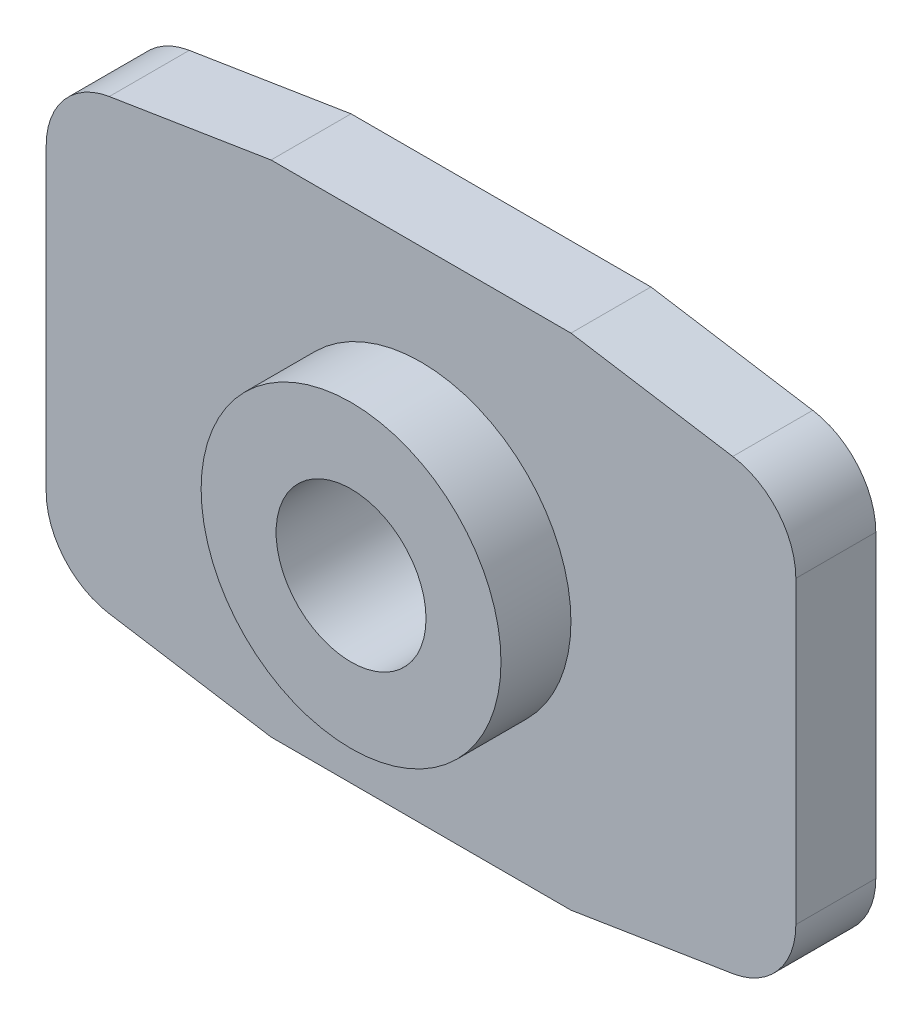
ISO-10303-21;
HEADER;
FILE_DESCRIPTION(('STEP AP214'),'2;1');
FILE_NAME('part.step','',(''),(''),'','','');
FILE_SCHEMA(('AUTOMOTIVE_DESIGN { 1 0 10303 214 1 1 1 1 }'));
ENDSEC;
DATA;
#1=APPLICATION_CONTEXT('core data for automotive mechanical design processes');
#2=APPLICATION_PROTOCOL_DEFINITION('international standard','automotive_design',2000,#1);
#3=PRODUCT_CONTEXT('',#1,'mechanical');
#4=PRODUCT('Part','Part','',(#3));
#5=PRODUCT_RELATED_PRODUCT_CATEGORY('part','',(#4));
#6=PRODUCT_DEFINITION_FORMATION('','',#4);
#7=PRODUCT_DEFINITION_CONTEXT('part definition',#1,'design');
#8=PRODUCT_DEFINITION('design','',#6,#7);
#9=PRODUCT_DEFINITION_SHAPE('','',#8);
#10=(LENGTH_UNIT() NAMED_UNIT(*) SI_UNIT(.MILLI.,.METRE.));
#11=(NAMED_UNIT(*) PLANE_ANGLE_UNIT() SI_UNIT($,.RADIAN.));
#12=(NAMED_UNIT(*) SI_UNIT($,.STERADIAN.) SOLID_ANGLE_UNIT());
#13=UNCERTAINTY_MEASURE_WITH_UNIT(LENGTH_MEASURE(1.E-05),#10,'distance_accuracy_value','');
#14=(GEOMETRIC_REPRESENTATION_CONTEXT(3) GLOBAL_UNCERTAINTY_ASSIGNED_CONTEXT((#13)) GLOBAL_UNIT_ASSIGNED_CONTEXT((#10,
#11,#12)) REPRESENTATION_CONTEXT('',''));
#15=CARTESIAN_POINT('',(0.,0.,0.));
#16=DIRECTION('',(0.,0.,1.));
#17=DIRECTION('',(1.,0.,0.));
#18=AXIS2_PLACEMENT_3D('',#15,#16,#17);
#19=CARTESIAN_POINT('',(6.,3.,1.6));
#20=DIRECTION('',(0.,0.,1.));
#21=DIRECTION('',(1.,0.,0.));
#22=AXIS2_PLACEMENT_3D('',#19,#20,#21);
#23=PLANE('',#22);
#24=CARTESIAN_POINT('',(6.,3.,1.6));
#25=DIRECTION('',(0.,0.,1.));
#26=DIRECTION('',(1.,0.,0.));
#27=AXIS2_PLACEMENT_3D('',#24,#25,#26);
#28=CIRCLE('',#27,1.5);
#29=CARTESIAN_POINT('',(7.5,3.,1.6));
#30=VERTEX_POINT('',#29);
#31=CARTESIAN_POINT('',(6.23739675280407,4.48109512920611,1.6));
#32=VERTEX_POINT('',#31);
#33=EDGE_CURVE('E185',#30,#32,#28,.T.);
#34=ORIENTED_EDGE('',*,*,#33,.T.);
#35=DIRECTION('',(-0.987396752804077,0.158264501869385,0.));
#36=VECTOR('',#35,1.);
#37=CARTESIAN_POINT('',(6.23739675280407,4.48109512920611,1.6));
#38=LINE('',#37,#36);
#39=CARTESIAN_POINT('',(3.,5.,1.6));
#40=VERTEX_POINT('',#39);
#41=EDGE_CURVE('E113',#32,#40,#38,.T.);
#42=ORIENTED_EDGE('',*,*,#41,.T.);
#43=DIRECTION('',(-1.,0.,0.));
#44=VECTOR('',#43,1.);
#45=CARTESIAN_POINT('',(-3.,5.,1.6));
#46=LINE('',#45,#44);
#47=CARTESIAN_POINT('',(-3.,5.,1.6));
#48=VERTEX_POINT('',#47);
#49=EDGE_CURVE('E212',#40,#48,#46,.T.);
#50=ORIENTED_EDGE('',*,*,#49,.T.);
#51=DIRECTION('',(-0.987396752804077,-0.158264501869386,0.));
#52=VECTOR('',#51,1.);
#53=CARTESIAN_POINT('',(-6.23739675280407,4.48109512920611,1.6));
#54=LINE('',#53,#52);
#55=CARTESIAN_POINT('',(-6.23739675280407,4.48109512920611,1.6));
#56=VERTEX_POINT('',#55);
#57=EDGE_CURVE('E230',#48,#56,#54,.T.);
#58=ORIENTED_EDGE('',*,*,#57,.T.);
#59=CARTESIAN_POINT('',(-6.,3.,1.6));
#60=DIRECTION('',(0.,0.,1.));
#61=DIRECTION('',(-1.,0.,0.));
#62=AXIS2_PLACEMENT_3D('',#59,#60,#61);
#63=CIRCLE('',#62,1.5);
#64=CARTESIAN_POINT('',(-7.5,3.,1.6));
#65=VERTEX_POINT('',#64);
#66=EDGE_CURVE('E227',#56,#65,#63,.T.);
#67=ORIENTED_EDGE('',*,*,#66,.T.);
#68=DIRECTION('',(0.,-1.,0.));
#69=VECTOR('',#68,1.);
#70=CARTESIAN_POINT('',(-7.5,-3.,1.6));
#71=LINE('',#70,#69);
#72=CARTESIAN_POINT('',(-7.5,-3.,1.6));
#73=VERTEX_POINT('',#72);
#74=EDGE_CURVE('E229',#65,#73,#71,.T.);
#75=ORIENTED_EDGE('',*,*,#74,.T.);
#76=CARTESIAN_POINT('',(-6.,-3.,1.6));
#77=DIRECTION('',(0.,0.,1.));
#78=DIRECTION('',(1.,0.,0.));
#79=AXIS2_PLACEMENT_3D('',#76,#77,#78);
#80=CIRCLE('',#79,1.5);
#81=CARTESIAN_POINT('',(-6.23739675280407,-4.48109512920612,1.6));
#82=VERTEX_POINT('',#81);
#83=EDGE_CURVE('E232',#73,#82,#80,.T.);
#84=ORIENTED_EDGE('',*,*,#83,.T.);
#85=DIRECTION('',(0.987396752804077,-0.158264501869385,0.));
#86=VECTOR('',#85,1.);
#87=CARTESIAN_POINT('',(-6.23739675280407,-4.48109512920612,1.6));
#88=LINE('',#87,#86);
#89=CARTESIAN_POINT('',(-3.,-5.,1.6));
#90=VERTEX_POINT('',#89);
#91=EDGE_CURVE('E238',#82,#90,#88,.T.);
#92=ORIENTED_EDGE('',*,*,#91,.T.);
#93=DIRECTION('',(1.,0.,0.));
#94=VECTOR('',#93,1.);
#95=CARTESIAN_POINT('',(-3.,-5.,1.6));
#96=LINE('',#95,#94);
#97=CARTESIAN_POINT('',(3.,-5.,1.6));
#98=VERTEX_POINT('',#97);
#99=EDGE_CURVE('E144',#90,#98,#96,.T.);
#100=ORIENTED_EDGE('',*,*,#99,.T.);
#101=DIRECTION('',(0.987396752804077,0.158264501869385,0.));
#102=VECTOR('',#101,1.);
#103=CARTESIAN_POINT('',(6.23739675280407,-4.48109512920611,1.6));
#104=LINE('',#103,#102);
#105=CARTESIAN_POINT('',(6.23739675280407,-4.48109512920612,1.6));
#106=VERTEX_POINT('',#105);
#107=EDGE_CURVE('E138',#98,#106,#104,.T.);
#108=ORIENTED_EDGE('',*,*,#107,.T.);
#109=CARTESIAN_POINT('',(6.,-3.,1.6));
#110=DIRECTION('',(0.,0.,1.));
#111=DIRECTION('',(-1.,0.,0.));
#112=AXIS2_PLACEMENT_3D('',#109,#110,#111);
#113=CIRCLE('',#112,1.5);
#114=CARTESIAN_POINT('',(7.5,-3.,1.6));
#115=VERTEX_POINT('',#114);
#116=EDGE_CURVE('E142',#106,#115,#113,.T.);
#117=ORIENTED_EDGE('',*,*,#116,.T.);
#118=DIRECTION('',(0.,1.,0.));
#119=VECTOR('',#118,1.);
#120=CARTESIAN_POINT('',(7.5,-3.,1.6));
#121=LINE('',#120,#119);
#122=EDGE_CURVE('E58',#115,#30,#121,.T.);
#123=ORIENTED_EDGE('',*,*,#122,.T.);
#124=EDGE_LOOP('',(#34,#42,#50,#58,#67,#75,#84,#92,#100,#108,#117,#123));
#125=FACE_BOUND('',#124,.T.);
#126=CARTESIAN_POINT('',(0.,0.,1.6));
#127=DIRECTION('',(0.,0.,1.));
#128=DIRECTION('',(1.,0.,0.));
#129=AXIS2_PLACEMENT_3D('',#126,#127,#128);
#130=CIRCLE('',#129,3.);
#131=CARTESIAN_POINT('',(3.,0.,1.6));
#132=VERTEX_POINT('',#131);
#133=EDGE_CURVE('E290',#132,#132,#130,.T.);
#134=ORIENTED_EDGE('',*,*,#133,.F.);
#135=EDGE_LOOP('',(#134));
#136=FACE_BOUND('',#135,.T.);
#137=ADVANCED_FACE('F41',(#125,#136),#23,.T.);
#138=CARTESIAN_POINT('',(6.,3.,1.6));
#139=DIRECTION('',(0.,0.,-1.));
#140=DIRECTION('',(-1.,0.,0.));
#141=AXIS2_PLACEMENT_3D('',#138,#139,#140);
#142=CYLINDRICAL_SURFACE('',#141,1.5);
#143=CARTESIAN_POINT('',(6.,3.,0.));
#144=DIRECTION('',(0.,0.,1.));
#145=DIRECTION('',(1.,0.,0.));
#146=AXIS2_PLACEMENT_3D('',#143,#144,#145);
#147=CIRCLE('',#146,1.5);
#148=CARTESIAN_POINT('',(7.5,3.,0.));
#149=VERTEX_POINT('',#148);
#150=CARTESIAN_POINT('',(6.23739675280407,4.48109512920611,0.));
#151=VERTEX_POINT('',#150);
#152=EDGE_CURVE('E162',#149,#151,#147,.T.);
#153=ORIENTED_EDGE('',*,*,#152,.T.);
#154=DIRECTION('',(0.,0.,-1.));
#155=VECTOR('',#154,1.);
#156=CARTESIAN_POINT('',(6.23739675280407,4.48109512920611,1.6));
#157=LINE('',#156,#155);
#158=EDGE_CURVE('E11',#32,#151,#157,.T.);
#159=ORIENTED_EDGE('',*,*,#158,.F.);
#160=ORIENTED_EDGE('',*,*,#33,.F.);
#161=DIRECTION('',(0.,0.,-1.));
#162=VECTOR('',#161,1.);
#163=CARTESIAN_POINT('',(7.5,3.,1.6));
#164=LINE('',#163,#162);
#165=EDGE_CURVE('E158',#30,#149,#164,.T.);
#166=ORIENTED_EDGE('',*,*,#165,.T.);
#167=EDGE_LOOP('',(#153,#159,#160,#166));
#168=FACE_BOUND('',#167,.T.);
#169=ADVANCED_FACE('F43',(#168),#142,.T.);
#170=CARTESIAN_POINT('',(6.23739675280407,4.48109512920611,1.6));
#171=DIRECTION('',(-0.158264501869385,-0.987396752804077,0.));
#172=DIRECTION('',(0.987396752804077,-0.158264501869385,0.));
#173=AXIS2_PLACEMENT_3D('',#170,#171,#172);
#174=PLANE('',#173);
#175=DIRECTION('',(-0.987396752804077,0.158264501869385,0.));
#176=VECTOR('',#175,1.);
#177=CARTESIAN_POINT('',(6.23739675280407,4.48109512920611,0.));
#178=LINE('',#177,#176);
#179=CARTESIAN_POINT('',(3.,5.,0.));
#180=VERTEX_POINT('',#179);
#181=EDGE_CURVE('E165',#151,#180,#178,.T.);
#182=ORIENTED_EDGE('',*,*,#181,.T.);
#183=DIRECTION('',(0.,0.,-1.));
#184=VECTOR('',#183,1.);
#185=CARTESIAN_POINT('',(3.,5.,1.6));
#186=LINE('',#185,#184);
#187=EDGE_CURVE('E50',#40,#180,#186,.T.);
#188=ORIENTED_EDGE('',*,*,#187,.F.);
#189=ORIENTED_EDGE('',*,*,#41,.F.);
#190=ORIENTED_EDGE('',*,*,#158,.T.);
#191=EDGE_LOOP('',(#182,#188,#189,#190));
#192=FACE_BOUND('',#191,.T.);
#193=ADVANCED_FACE('F269',(#192),#174,.F.);
#194=CARTESIAN_POINT('',(-3.,5.,1.6));
#195=DIRECTION('',(0.,-1.,0.));
#196=DIRECTION('',(0.,0.,-1.));
#197=AXIS2_PLACEMENT_3D('',#194,#195,#196);
#198=PLANE('',#197);
#199=DIRECTION('',(-1.,0.,0.));
#200=VECTOR('',#199,1.);
#201=CARTESIAN_POINT('',(-3.,5.,0.));
#202=LINE('',#201,#200);
#203=CARTESIAN_POINT('',(-3.,5.,0.));
#204=VERTEX_POINT('',#203);
#205=EDGE_CURVE('E168',#180,#204,#202,.T.);
#206=ORIENTED_EDGE('',*,*,#205,.T.);
#207=DIRECTION('',(0.,0.,-1.));
#208=VECTOR('',#207,1.);
#209=CARTESIAN_POINT('',(-3.,5.,1.6));
#210=LINE('',#209,#208);
#211=EDGE_CURVE('E204',#48,#204,#210,.T.);
#212=ORIENTED_EDGE('',*,*,#211,.F.);
#213=ORIENTED_EDGE('',*,*,#49,.F.);
#214=ORIENTED_EDGE('',*,*,#187,.T.);
#215=EDGE_LOOP('',(#206,#212,#213,#214));
#216=FACE_BOUND('',#215,.T.);
#217=ADVANCED_FACE('F210',(#216),#198,.F.);
#218=CARTESIAN_POINT('',(-6.23739675280407,4.48109512920611,1.6));
#219=DIRECTION('',(0.158264501869386,-0.987396752804077,0.));
#220=DIRECTION('',(0.987396752804077,0.158264501869386,0.));
#221=AXIS2_PLACEMENT_3D('',#218,#219,#220);
#222=PLANE('',#221);
#223=DIRECTION('',(-0.987396752804077,-0.158264501869386,0.));
#224=VECTOR('',#223,1.);
#225=CARTESIAN_POINT('',(-6.23739675280407,4.48109512920611,0.));
#226=LINE('',#225,#224);
#227=CARTESIAN_POINT('',(-6.23739675280407,4.48109512920611,0.));
#228=VERTEX_POINT('',#227);
#229=EDGE_CURVE('E170',#204,#228,#226,.T.);
#230=ORIENTED_EDGE('',*,*,#229,.T.);
#231=DIRECTION('',(0.,0.,-1.));
#232=VECTOR('',#231,1.);
#233=CARTESIAN_POINT('',(-6.23739675280407,4.48109512920611,1.6));
#234=LINE('',#233,#232);
#235=EDGE_CURVE('E201',#56,#228,#234,.T.);
#236=ORIENTED_EDGE('',*,*,#235,.F.);
#237=ORIENTED_EDGE('',*,*,#57,.F.);
#238=ORIENTED_EDGE('',*,*,#211,.T.);
#239=EDGE_LOOP('',(#230,#236,#237,#238));
#240=FACE_BOUND('',#239,.T.);
#241=ADVANCED_FACE('F221',(#240),#222,.F.);
#242=CARTESIAN_POINT('',(-6.,3.,1.6));
#243=DIRECTION('',(0.,0.,-1.));
#244=DIRECTION('',(-1.,0.,0.));
#245=AXIS2_PLACEMENT_3D('',#242,#243,#244);
#246=CYLINDRICAL_SURFACE('',#245,1.5);
#247=CARTESIAN_POINT('',(-6.,3.,0.));
#248=DIRECTION('',(0.,0.,1.));
#249=DIRECTION('',(-1.,0.,0.));
#250=AXIS2_PLACEMENT_3D('',#247,#248,#249);
#251=CIRCLE('',#250,1.5);
#252=CARTESIAN_POINT('',(-7.5,3.,0.));
#253=VERTEX_POINT('',#252);
#254=EDGE_CURVE('E172',#228,#253,#251,.T.);
#255=ORIENTED_EDGE('',*,*,#254,.T.);
#256=DIRECTION('',(0.,0.,-1.));
#257=VECTOR('',#256,1.);
#258=CARTESIAN_POINT('',(-7.5,3.,1.6));
#259=LINE('',#258,#257);
#260=EDGE_CURVE('E198',#65,#253,#259,.T.);
#261=ORIENTED_EDGE('',*,*,#260,.F.);
#262=ORIENTED_EDGE('',*,*,#66,.F.);
#263=ORIENTED_EDGE('',*,*,#235,.T.);
#264=EDGE_LOOP('',(#255,#261,#262,#263));
#265=FACE_BOUND('',#264,.T.);
#266=ADVANCED_FACE('F225',(#265),#246,.T.);
#267=CARTESIAN_POINT('',(-7.5,-3.,1.6));
#268=DIRECTION('',(1.,0.,0.));
#269=DIRECTION('',(0.,0.,-1.));
#270=AXIS2_PLACEMENT_3D('',#267,#268,#269);
#271=PLANE('',#270);
#272=DIRECTION('',(0.,-1.,0.));
#273=VECTOR('',#272,1.);
#274=CARTESIAN_POINT('',(-7.5,-3.,0.));
#275=LINE('',#274,#273);
#276=CARTESIAN_POINT('',(-7.5,-3.,0.));
#277=VERTEX_POINT('',#276);
#278=EDGE_CURVE('E174',#253,#277,#275,.T.);
#279=ORIENTED_EDGE('',*,*,#278,.T.);
#280=DIRECTION('',(0.,0.,-1.));
#281=VECTOR('',#280,1.);
#282=CARTESIAN_POINT('',(-7.5,-3.,1.6));
#283=LINE('',#282,#281);
#284=EDGE_CURVE('E195',#73,#277,#283,.T.);
#285=ORIENTED_EDGE('',*,*,#284,.F.);
#286=ORIENTED_EDGE('',*,*,#74,.F.);
#287=ORIENTED_EDGE('',*,*,#260,.T.);
#288=EDGE_LOOP('',(#279,#285,#286,#287));
#289=FACE_BOUND('',#288,.T.);
#290=ADVANCED_FACE('F348',(#289),#271,.F.);
#291=CARTESIAN_POINT('',(-6.,-3.,1.6));
#292=DIRECTION('',(0.,0.,-1.));
#293=DIRECTION('',(-1.,0.,0.));
#294=AXIS2_PLACEMENT_3D('',#291,#292,#293);
#295=CYLINDRICAL_SURFACE('',#294,1.5);
#296=CARTESIAN_POINT('',(-6.,-3.,0.));
#297=DIRECTION('',(0.,0.,1.));
#298=DIRECTION('',(1.,0.,0.));
#299=AXIS2_PLACEMENT_3D('',#296,#297,#298);
#300=CIRCLE('',#299,1.5);
#301=CARTESIAN_POINT('',(-6.23739675280407,-4.48109512920612,0.));
#302=VERTEX_POINT('',#301);
#303=EDGE_CURVE('E176',#277,#302,#300,.T.);
#304=ORIENTED_EDGE('',*,*,#303,.T.);
#305=DIRECTION('',(0.,0.,-1.));
#306=VECTOR('',#305,1.);
#307=CARTESIAN_POINT('',(-6.23739675280407,-4.48109512920612,1.6));
#308=LINE('',#307,#306);
#309=EDGE_CURVE('E192',#82,#302,#308,.T.);
#310=ORIENTED_EDGE('',*,*,#309,.F.);
#311=ORIENTED_EDGE('',*,*,#83,.F.);
#312=ORIENTED_EDGE('',*,*,#284,.T.);
#313=EDGE_LOOP('',(#304,#310,#311,#312));
#314=FACE_BOUND('',#313,.T.);
#315=ADVANCED_FACE('F341',(#314),#295,.T.);
#316=CARTESIAN_POINT('',(-6.23739675280407,-4.48109512920612,1.6));
#317=DIRECTION('',(0.158264501869385,0.987396752804077,0.));
#318=DIRECTION('',(-0.987396752804077,0.158264501869385,0.));
#319=AXIS2_PLACEMENT_3D('',#316,#317,#318);
#320=PLANE('',#319);
#321=DIRECTION('',(0.987396752804077,-0.158264501869385,0.));
#322=VECTOR('',#321,1.);
#323=CARTESIAN_POINT('',(-6.23739675280407,-4.48109512920612,0.));
#324=LINE('',#323,#322);
#325=CARTESIAN_POINT('',(-3.,-5.,0.));
#326=VERTEX_POINT('',#325);
#327=EDGE_CURVE('E178',#302,#326,#324,.T.);
#328=ORIENTED_EDGE('',*,*,#327,.T.);
#329=DIRECTION('',(0.,0.,-1.));
#330=VECTOR('',#329,1.);
#331=CARTESIAN_POINT('',(-3.,-5.,1.6));
#332=LINE('',#331,#330);
#333=EDGE_CURVE('E189',#90,#326,#332,.T.);
#334=ORIENTED_EDGE('',*,*,#333,.F.);
#335=ORIENTED_EDGE('',*,*,#91,.F.);
#336=ORIENTED_EDGE('',*,*,#309,.T.);
#337=EDGE_LOOP('',(#328,#334,#335,#336));
#338=FACE_BOUND('',#337,.T.);
#339=ADVANCED_FACE('F244',(#338),#320,.F.);
#340=CARTESIAN_POINT('',(-3.,-5.,1.6));
#341=DIRECTION('',(0.,1.,0.));
#342=DIRECTION('',(0.,0.,1.));
#343=AXIS2_PLACEMENT_3D('',#340,#341,#342);
#344=PLANE('',#343);
#345=DIRECTION('',(1.,0.,0.));
#346=VECTOR('',#345,1.);
#347=CARTESIAN_POINT('',(-3.,-5.,0.));
#348=LINE('',#347,#346);
#349=CARTESIAN_POINT('',(3.,-5.,0.));
#350=VERTEX_POINT('',#349);
#351=EDGE_CURVE('E180',#326,#350,#348,.T.);
#352=ORIENTED_EDGE('',*,*,#351,.T.);
#353=DIRECTION('',(0.,0.,-1.));
#354=VECTOR('',#353,1.);
#355=CARTESIAN_POINT('',(3.,-5.,1.6));
#356=LINE('',#355,#354);
#357=EDGE_CURVE('E153',#98,#350,#356,.T.);
#358=ORIENTED_EDGE('',*,*,#357,.F.);
#359=ORIENTED_EDGE('',*,*,#99,.F.);
#360=ORIENTED_EDGE('',*,*,#333,.T.);
#361=EDGE_LOOP('',(#352,#358,#359,#360));
#362=FACE_BOUND('',#361,.T.);
#363=ADVANCED_FACE('F248',(#362),#344,.F.);
#364=CARTESIAN_POINT('',(6.23739675280407,-4.48109512920611,1.6));
#365=DIRECTION('',(-0.158264501869385,0.987396752804077,0.));
#366=DIRECTION('',(-0.987396752804077,-0.158264501869385,0.));
#367=AXIS2_PLACEMENT_3D('',#364,#365,#366);
#368=PLANE('',#367);
#369=DIRECTION('',(0.987396752804077,0.158264501869385,0.));
#370=VECTOR('',#369,1.);
#371=CARTESIAN_POINT('',(6.23739675280407,-4.48109512920611,0.));
#372=LINE('',#371,#370);
#373=CARTESIAN_POINT('',(6.23739675280407,-4.48109512920612,0.));
#374=VERTEX_POINT('',#373);
#375=EDGE_CURVE('E152',#350,#374,#372,.T.);
#376=ORIENTED_EDGE('',*,*,#375,.T.);
#377=DIRECTION('',(0.,0.,-1.));
#378=VECTOR('',#377,1.);
#379=CARTESIAN_POINT('',(6.23739675280407,-4.48109512920612,1.6));
#380=LINE('',#379,#378);
#381=EDGE_CURVE('E149',#106,#374,#380,.T.);
#382=ORIENTED_EDGE('',*,*,#381,.F.);
#383=ORIENTED_EDGE('',*,*,#107,.F.);
#384=ORIENTED_EDGE('',*,*,#357,.T.);
#385=EDGE_LOOP('',(#376,#382,#383,#384));
#386=FACE_BOUND('',#385,.T.);
#387=ADVANCED_FACE('F150',(#386),#368,.F.);
#388=CARTESIAN_POINT('',(6.,-3.,1.6));
#389=DIRECTION('',(0.,0.,-1.));
#390=DIRECTION('',(-1.,0.,0.));
#391=AXIS2_PLACEMENT_3D('',#388,#389,#390);
#392=CYLINDRICAL_SURFACE('',#391,1.5);
#393=CARTESIAN_POINT('',(6.,-3.,0.));
#394=DIRECTION('',(0.,0.,1.));
#395=DIRECTION('',(-1.,0.,0.));
#396=AXIS2_PLACEMENT_3D('',#393,#394,#395);
#397=CIRCLE('',#396,1.5);
#398=CARTESIAN_POINT('',(7.5,-3.,0.));
#399=VERTEX_POINT('',#398);
#400=EDGE_CURVE('E99',#374,#399,#397,.T.);
#401=ORIENTED_EDGE('',*,*,#400,.T.);
#402=DIRECTION('',(0.,0.,-1.));
#403=VECTOR('',#402,1.);
#404=CARTESIAN_POINT('',(7.5,-3.,1.6));
#405=LINE('',#404,#403);
#406=EDGE_CURVE('E154',#115,#399,#405,.T.);
#407=ORIENTED_EDGE('',*,*,#406,.F.);
#408=ORIENTED_EDGE('',*,*,#116,.F.);
#409=ORIENTED_EDGE('',*,*,#381,.T.);
#410=EDGE_LOOP('',(#401,#407,#408,#409));
#411=FACE_BOUND('',#410,.T.);
#412=ADVANCED_FACE('F156',(#411),#392,.T.);
#413=CARTESIAN_POINT('',(7.5,-3.,1.6));
#414=DIRECTION('',(-1.,0.,0.));
#415=DIRECTION('',(0.,-1.,0.));
#416=AXIS2_PLACEMENT_3D('',#413,#414,#415);
#417=PLANE('',#416);
#418=DIRECTION('',(0.,1.,0.));
#419=VECTOR('',#418,1.);
#420=CARTESIAN_POINT('',(7.5,-3.,0.));
#421=LINE('',#420,#419);
#422=EDGE_CURVE('E105',#399,#149,#421,.T.);
#423=ORIENTED_EDGE('',*,*,#422,.T.);
#424=ORIENTED_EDGE('',*,*,#165,.F.);
#425=ORIENTED_EDGE('',*,*,#122,.F.);
#426=ORIENTED_EDGE('',*,*,#406,.T.);
#427=EDGE_LOOP('',(#423,#424,#425,#426));
#428=FACE_BOUND('',#427,.T.);
#429=ADVANCED_FACE('F252',(#428),#417,.F.);
#430=CARTESIAN_POINT('',(6.,3.,0.));
#431=DIRECTION('',(0.,0.,1.));
#432=DIRECTION('',(1.,0.,0.));
#433=AXIS2_PLACEMENT_3D('',#430,#431,#432);
#434=PLANE('',#433);
#435=CARTESIAN_POINT('',(0.,0.,0.));
#436=DIRECTION('',(0.,0.,1.));
#437=DIRECTION('',(1.,0.,0.));
#438=AXIS2_PLACEMENT_3D('',#435,#436,#437);
#439=CIRCLE('',#438,1.5);
#440=CARTESIAN_POINT('',(1.5,0.,0.));
#441=VERTEX_POINT('',#440);
#442=EDGE_CURVE('E285',#441,#441,#439,.T.);
#443=ORIENTED_EDGE('',*,*,#442,.T.);
#444=EDGE_LOOP('',(#443));
#445=FACE_BOUND('',#444,.T.);
#446=ORIENTED_EDGE('',*,*,#152,.F.);
#447=ORIENTED_EDGE('',*,*,#422,.F.);
#448=ORIENTED_EDGE('',*,*,#400,.F.);
#449=ORIENTED_EDGE('',*,*,#375,.F.);
#450=ORIENTED_EDGE('',*,*,#351,.F.);
#451=ORIENTED_EDGE('',*,*,#327,.F.);
#452=ORIENTED_EDGE('',*,*,#303,.F.);
#453=ORIENTED_EDGE('',*,*,#278,.F.);
#454=ORIENTED_EDGE('',*,*,#254,.F.);
#455=ORIENTED_EDGE('',*,*,#229,.F.);
#456=ORIENTED_EDGE('',*,*,#205,.F.);
#457=ORIENTED_EDGE('',*,*,#181,.F.);
#458=EDGE_LOOP('',(#446,#447,#448,#449,#450,#451,#452,#453,#454,#455,#456,#457));
#459=FACE_BOUND('',#458,.T.);
#460=ADVANCED_FACE('F216',(#445,#459),#434,.F.);
#461=CARTESIAN_POINT('',(0.,0.,3.));
#462=DIRECTION('',(0.,0.,-1.));
#463=DIRECTION('',(-1.,0.,0.));
#464=AXIS2_PLACEMENT_3D('',#461,#462,#463);
#465=CYLINDRICAL_SURFACE('',#464,3.);
#466=CARTESIAN_POINT('',(0.,0.,3.));
#467=DIRECTION('',(0.,0.,1.));
#468=DIRECTION('',(1.,0.,0.));
#469=AXIS2_PLACEMENT_3D('',#466,#467,#468);
#470=CIRCLE('',#469,3.);
#471=CARTESIAN_POINT('',(3.,0.,3.));
#472=VERTEX_POINT('',#471);
#473=EDGE_CURVE('E166',#472,#472,#470,.T.);
#474=ORIENTED_EDGE('',*,*,#473,.F.);
#475=EDGE_LOOP('',(#474));
#476=FACE_BOUND('',#475,.T.);
#477=ORIENTED_EDGE('',*,*,#133,.T.);
#478=EDGE_LOOP('',(#477));
#479=FACE_BOUND('',#478,.T.);
#480=ADVANCED_FACE('F260',(#476,#479),#465,.T.);
#481=CARTESIAN_POINT('',(0.,0.,3.));
#482=DIRECTION('',(0.,0.,1.));
#483=DIRECTION('',(1.,0.,0.));
#484=AXIS2_PLACEMENT_3D('',#481,#482,#483);
#485=PLANE('',#484);
#486=CARTESIAN_POINT('',(0.,0.,3.));
#487=DIRECTION('',(0.,0.,1.));
#488=DIRECTION('',(1.,0.,0.));
#489=AXIS2_PLACEMENT_3D('',#486,#487,#488);
#490=CIRCLE('',#489,1.5);
#491=CARTESIAN_POINT('',(1.5,0.,3.));
#492=VERTEX_POINT('',#491);
#493=EDGE_CURVE('E288',#492,#492,#490,.T.);
#494=ORIENTED_EDGE('',*,*,#493,.F.);
#495=EDGE_LOOP('',(#494));
#496=FACE_BOUND('',#495,.T.);
#497=ORIENTED_EDGE('',*,*,#473,.T.);
#498=EDGE_LOOP('',(#497));
#499=FACE_BOUND('',#498,.T.);
#500=ADVANCED_FACE('F272',(#496,#499),#485,.T.);
#501=CARTESIAN_POINT('',(0.,0.,3.));
#502=DIRECTION('',(0.,0.,1.));
#503=DIRECTION('',(1.,0.,0.));
#504=AXIS2_PLACEMENT_3D('',#501,#502,#503);
#505=CYLINDRICAL_SURFACE('',#504,1.5);
#506=ORIENTED_EDGE('',*,*,#442,.F.);
#507=EDGE_LOOP('',(#506));
#508=FACE_BOUND('',#507,.T.);
#509=ORIENTED_EDGE('',*,*,#493,.T.);
#510=EDGE_LOOP('',(#509));
#511=FACE_BOUND('',#510,.T.);
#512=ADVANCED_FACE('F276',(#508,#511),#505,.F.);
#513=CLOSED_SHELL('',(#137,#169,#193,#217,#241,#266,#290,#315,#339,#363,#387,#412,#429,#460,
#480,#500,#512));
#514=MANIFOLD_SOLID_BREP('B2',#513);
#515=ADVANCED_BREP_SHAPE_REPRESENTATION('',(#18,#514),#14);
#516=SHAPE_DEFINITION_REPRESENTATION(#9,#515);
ENDSEC;
END-ISO-10303-21;
